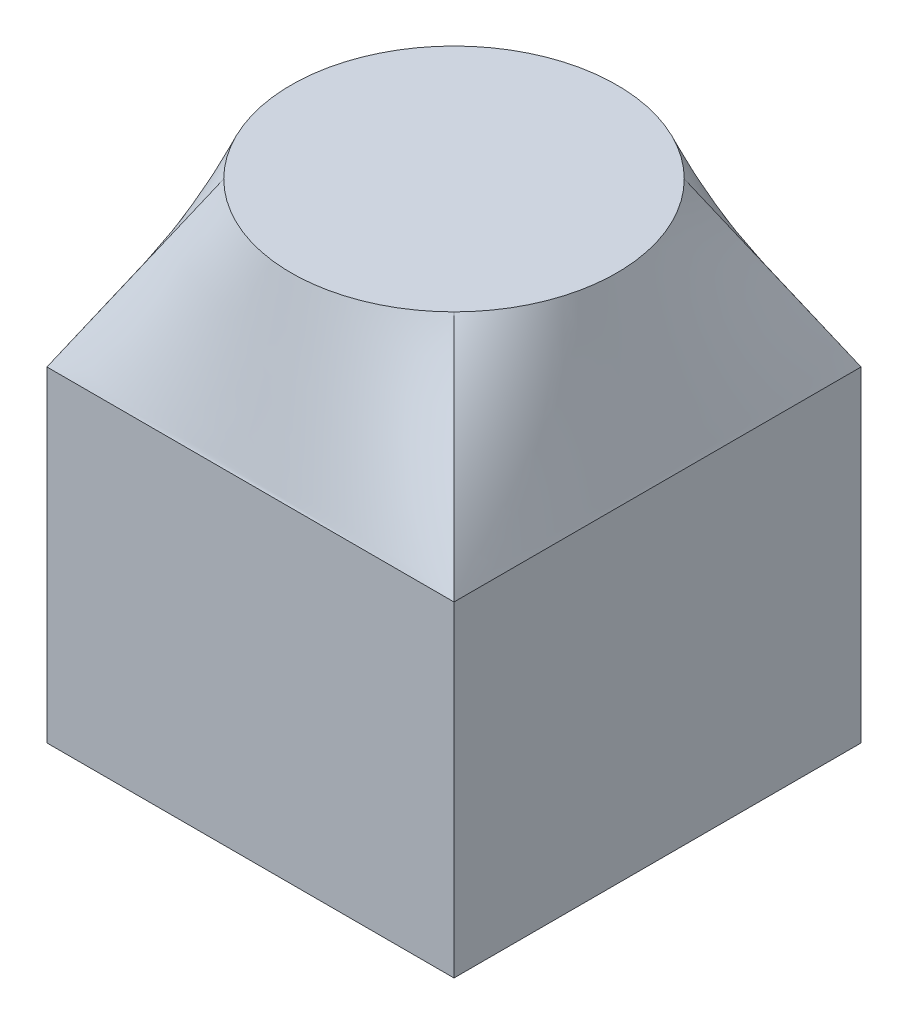
ISO-10303-21;
HEADER;
FILE_DESCRIPTION(('STEP AP214'),'2;1');
FILE_NAME('part.step','',(''),(''),'','','');
FILE_SCHEMA(('AUTOMOTIVE_DESIGN { 1 0 10303 214 1 1 1 1 }'));
ENDSEC;
DATA;
#1=APPLICATION_CONTEXT('core data for automotive mechanical design processes');
#2=APPLICATION_PROTOCOL_DEFINITION('international standard','automotive_design',2000,#1);
#3=PRODUCT_CONTEXT('',#1,'mechanical');
#4=PRODUCT('Part','Part','',(#3));
#5=PRODUCT_RELATED_PRODUCT_CATEGORY('part','',(#4));
#6=PRODUCT_DEFINITION_FORMATION('','',#4);
#7=PRODUCT_DEFINITION_CONTEXT('part definition',#1,'design');
#8=PRODUCT_DEFINITION('design','',#6,#7);
#9=PRODUCT_DEFINITION_SHAPE('','',#8);
#10=(LENGTH_UNIT() NAMED_UNIT(*) SI_UNIT(.MILLI.,.METRE.));
#11=(NAMED_UNIT(*) PLANE_ANGLE_UNIT() SI_UNIT($,.RADIAN.));
#12=(NAMED_UNIT(*) SI_UNIT($,.STERADIAN.) SOLID_ANGLE_UNIT());
#13=UNCERTAINTY_MEASURE_WITH_UNIT(LENGTH_MEASURE(1.E-05),#10,'distance_accuracy_value','');
#14=(GEOMETRIC_REPRESENTATION_CONTEXT(3) GLOBAL_UNCERTAINTY_ASSIGNED_CONTEXT((#13)) GLOBAL_UNIT_ASSIGNED_CONTEXT((#10,
#11,#12)) REPRESENTATION_CONTEXT('',''));
#15=CARTESIAN_POINT('',(0.,0.,0.));
#16=DIRECTION('',(0.,0.,1.));
#17=DIRECTION('',(1.,0.,0.));
#18=AXIS2_PLACEMENT_3D('',#15,#16,#17);
#19=CARTESIAN_POINT('',(12.5,20.,12.5));
#20=DIRECTION('',(-1.,0.,0.));
#21=DIRECTION('',(0.,0.,1.));
#22=AXIS2_PLACEMENT_3D('',#19,#20,#21);
#23=PLANE('',#22);
#24=DIRECTION('',(0.,0.,-1.));
#25=VECTOR('',#24,1.);
#26=CARTESIAN_POINT('',(12.5,0.,12.5));
#27=LINE('',#26,#25);
#28=CARTESIAN_POINT('',(12.5,0.,12.5));
#29=VERTEX_POINT('',#28);
#30=CARTESIAN_POINT('',(12.5,0.,-12.5));
#31=VERTEX_POINT('',#30);
#32=EDGE_CURVE('E234',#29,#31,#27,.T.);
#33=ORIENTED_EDGE('',*,*,#32,.T.);
#34=DIRECTION('',(0.,-1.,0.));
#35=VECTOR('',#34,1.);
#36=CARTESIAN_POINT('',(12.5,20.,-12.5));
#37=LINE('',#36,#35);
#38=CARTESIAN_POINT('',(12.5,20.,-12.5));
#39=VERTEX_POINT('',#38);
#40=EDGE_CURVE('E12',#39,#31,#37,.T.);
#41=ORIENTED_EDGE('',*,*,#40,.F.);
#42=DIRECTION('',(0.,0.,1.));
#43=VECTOR('',#42,1.);
#44=CARTESIAN_POINT('',(12.5,20.,12.5));
#45=LINE('',#44,#43);
#46=CARTESIAN_POINT('',(12.5,20.,12.5));
#47=VERTEX_POINT('',#46);
#48=EDGE_CURVE('E65',#47,#39,#45,.F.);
#49=ORIENTED_EDGE('',*,*,#48,.F.);
#50=DIRECTION('',(0.,-1.,0.));
#51=VECTOR('',#50,1.);
#52=CARTESIAN_POINT('',(12.5,20.,12.5));
#53=LINE('',#52,#51);
#54=EDGE_CURVE('E109',#47,#29,#53,.T.);
#55=ORIENTED_EDGE('',*,*,#54,.T.);
#56=EDGE_LOOP('',(#33,#41,#49,#55));
#57=FACE_BOUND('',#56,.T.);
#58=ADVANCED_FACE('F62',(#57),#23,.F.);
#59=CARTESIAN_POINT('',(-12.5,20.,-12.5));
#60=DIRECTION('',(0.,0.,1.));
#61=DIRECTION('',(1.,0.,0.));
#62=AXIS2_PLACEMENT_3D('',#59,#60,#61);
#63=PLANE('',#62);
#64=DIRECTION('',(-1.,0.,0.));
#65=VECTOR('',#64,1.);
#66=CARTESIAN_POINT('',(-12.5,0.,-12.5));
#67=LINE('',#66,#65);
#68=CARTESIAN_POINT('',(-12.5,0.,-12.5));
#69=VERTEX_POINT('',#68);
#70=EDGE_CURVE('E226',#31,#69,#67,.T.);
#71=ORIENTED_EDGE('',*,*,#70,.T.);
#72=DIRECTION('',(0.,-1.,0.));
#73=VECTOR('',#72,1.);
#74=CARTESIAN_POINT('',(-12.5,20.,-12.5));
#75=LINE('',#74,#73);
#76=CARTESIAN_POINT('',(-12.5,20.,-12.5));
#77=VERTEX_POINT('',#76);
#78=EDGE_CURVE('E71',#77,#69,#75,.T.);
#79=ORIENTED_EDGE('',*,*,#78,.F.);
#80=DIRECTION('',(1.,0.,0.));
#81=VECTOR('',#80,1.);
#82=CARTESIAN_POINT('',(-12.5,20.,-12.5));
#83=LINE('',#82,#81);
#84=EDGE_CURVE('E129',#39,#77,#83,.F.);
#85=ORIENTED_EDGE('',*,*,#84,.F.);
#86=ORIENTED_EDGE('',*,*,#40,.T.);
#87=EDGE_LOOP('',(#71,#79,#85,#86));
#88=FACE_BOUND('',#87,.T.);
#89=ADVANCED_FACE('F216',(#88),#63,.F.);
#90=CARTESIAN_POINT('',(-12.5,20.,12.5));
#91=DIRECTION('',(1.,0.,0.));
#92=DIRECTION('',(0.,0.,-1.));
#93=AXIS2_PLACEMENT_3D('',#90,#91,#92);
#94=PLANE('',#93);
#95=DIRECTION('',(0.,0.,1.));
#96=VECTOR('',#95,1.);
#97=CARTESIAN_POINT('',(-12.5,0.,12.5));
#98=LINE('',#97,#96);
#99=CARTESIAN_POINT('',(-12.5,0.,12.5));
#100=VERTEX_POINT('',#99);
#101=EDGE_CURVE('E105',#69,#100,#98,.T.);
#102=ORIENTED_EDGE('',*,*,#101,.T.);
#103=DIRECTION('',(0.,-1.,0.));
#104=VECTOR('',#103,1.);
#105=CARTESIAN_POINT('',(-12.5,20.,12.5));
#106=LINE('',#105,#104);
#107=CARTESIAN_POINT('',(-12.5,20.,12.5));
#108=VERTEX_POINT('',#107);
#109=EDGE_CURVE('E96',#108,#100,#106,.T.);
#110=ORIENTED_EDGE('',*,*,#109,.F.);
#111=DIRECTION('',(0.,0.,-1.));
#112=VECTOR('',#111,1.);
#113=CARTESIAN_POINT('',(-12.5,20.,12.5));
#114=LINE('',#113,#112);
#115=EDGE_CURVE('E101',#77,#108,#114,.F.);
#116=ORIENTED_EDGE('',*,*,#115,.F.);
#117=ORIENTED_EDGE('',*,*,#78,.T.);
#118=EDGE_LOOP('',(#102,#110,#116,#117));
#119=FACE_BOUND('',#118,.T.);
#120=ADVANCED_FACE('F98',(#119),#94,.F.);
#121=CARTESIAN_POINT('',(-12.5,20.,12.5));
#122=DIRECTION('',(0.,0.,-1.));
#123=DIRECTION('',(-1.,0.,0.));
#124=AXIS2_PLACEMENT_3D('',#121,#122,#123);
#125=PLANE('',#124);
#126=DIRECTION('',(1.,0.,0.));
#127=VECTOR('',#126,1.);
#128=CARTESIAN_POINT('',(-12.5,0.,12.5));
#129=LINE('',#128,#127);
#130=EDGE_CURVE('E237',#100,#29,#129,.T.);
#131=ORIENTED_EDGE('',*,*,#130,.T.);
#132=ORIENTED_EDGE('',*,*,#54,.F.);
#133=DIRECTION('',(-1.,0.,0.));
#134=VECTOR('',#133,1.);
#135=CARTESIAN_POINT('',(-12.5,20.,12.5));
#136=LINE('',#135,#134);
#137=EDGE_CURVE('E112',#108,#47,#136,.F.);
#138=ORIENTED_EDGE('',*,*,#137,.F.);
#139=ORIENTED_EDGE('',*,*,#109,.T.);
#140=EDGE_LOOP('',(#131,#132,#138,#139));
#141=FACE_BOUND('',#140,.T.);
#142=ADVANCED_FACE('F113',(#141),#125,.F.);
#143=CARTESIAN_POINT('',(0.,0.,0.));
#144=DIRECTION('',(0.,-1.,0.));
#145=DIRECTION('',(0.,0.,-1.));
#146=AXIS2_PLACEMENT_3D('',#143,#144,#145);
#147=PLANE('',#146);
#148=DIRECTION('',(0.,0.,1.));
#149=VECTOR('',#148,1.);
#150=CARTESIAN_POINT('',(9.4,0.,-9.4));
#151=LINE('',#150,#149);
#152=CARTESIAN_POINT('',(9.4,0.,-9.4));
#153=VERTEX_POINT('',#152);
#154=CARTESIAN_POINT('',(9.4,0.,9.4));
#155=VERTEX_POINT('',#154);
#156=EDGE_CURVE('E80',#153,#155,#151,.T.);
#157=ORIENTED_EDGE('',*,*,#156,.F.);
#158=DIRECTION('',(1.,0.,0.));
#159=VECTOR('',#158,1.);
#160=CARTESIAN_POINT('',(-9.4,0.,-9.4));
#161=LINE('',#160,#159);
#162=CARTESIAN_POINT('',(-9.4,0.,-9.4));
#163=VERTEX_POINT('',#162);
#164=EDGE_CURVE('E262',#163,#153,#161,.T.);
#165=ORIENTED_EDGE('',*,*,#164,.F.);
#166=DIRECTION('',(0.,0.,-1.));
#167=VECTOR('',#166,1.);
#168=CARTESIAN_POINT('',(-9.4,0.,-9.4));
#169=LINE('',#168,#167);
#170=CARTESIAN_POINT('',(-9.4,0.,9.4));
#171=VERTEX_POINT('',#170);
#172=EDGE_CURVE('E266',#171,#163,#169,.T.);
#173=ORIENTED_EDGE('',*,*,#172,.F.);
#174=DIRECTION('',(-1.,0.,0.));
#175=VECTOR('',#174,1.);
#176=CARTESIAN_POINT('',(-9.4,0.,9.4));
#177=LINE('',#176,#175);
#178=EDGE_CURVE('E269',#155,#171,#177,.T.);
#179=ORIENTED_EDGE('',*,*,#178,.F.);
#180=EDGE_LOOP('',(#157,#165,#173,#179));
#181=FACE_BOUND('',#180,.T.);
#182=ORIENTED_EDGE('',*,*,#32,.F.);
#183=ORIENTED_EDGE('',*,*,#130,.F.);
#184=ORIENTED_EDGE('',*,*,#101,.F.);
#185=ORIENTED_EDGE('',*,*,#70,.F.);
#186=EDGE_LOOP('',(#182,#183,#184,#185));
#187=FACE_BOUND('',#186,.T.);
#188=ADVANCED_FACE('F209',(#181,#187),#147,.T.);
#189=CARTESIAN_POINT('',(9.4,18.8,-9.4));
#190=DIRECTION('',(1.,0.,0.));
#191=DIRECTION('',(0.,0.,-1.));
#192=AXIS2_PLACEMENT_3D('',#189,#190,#191);
#193=PLANE('',#192);
#194=ORIENTED_EDGE('',*,*,#156,.T.);
#195=DIRECTION('',(0.,-1.,0.));
#196=VECTOR('',#195,1.);
#197=CARTESIAN_POINT('',(9.4,18.8,9.4));
#198=LINE('',#197,#196);
#199=CARTESIAN_POINT('',(9.4,18.8,9.4));
#200=VERTEX_POINT('',#199);
#201=EDGE_CURVE('E254',#200,#155,#198,.T.);
#202=ORIENTED_EDGE('',*,*,#201,.F.);
#203=DIRECTION('',(0.,0.,1.));
#204=VECTOR('',#203,1.);
#205=CARTESIAN_POINT('',(9.4,18.8,-9.4));
#206=LINE('',#205,#204);
#207=CARTESIAN_POINT('',(9.4,18.8,-9.4));
#208=VERTEX_POINT('',#207);
#209=EDGE_CURVE('E265',#208,#200,#206,.T.);
#210=ORIENTED_EDGE('',*,*,#209,.F.);
#211=DIRECTION('',(0.,-1.,0.));
#212=VECTOR('',#211,1.);
#213=CARTESIAN_POINT('',(9.4,18.8,-9.4));
#214=LINE('',#213,#212);
#215=EDGE_CURVE('E250',#208,#153,#214,.T.);
#216=ORIENTED_EDGE('',*,*,#215,.T.);
#217=EDGE_LOOP('',(#194,#202,#210,#216));
#218=FACE_BOUND('',#217,.T.);
#219=ADVANCED_FACE('F199',(#218),#193,.F.);
#220=CARTESIAN_POINT('',(-9.4,18.8,-9.4));
#221=DIRECTION('',(0.,0.,-1.));
#222=DIRECTION('',(-1.,0.,0.));
#223=AXIS2_PLACEMENT_3D('',#220,#221,#222);
#224=PLANE('',#223);
#225=ORIENTED_EDGE('',*,*,#164,.T.);
#226=ORIENTED_EDGE('',*,*,#215,.F.);
#227=DIRECTION('',(1.,0.,0.));
#228=VECTOR('',#227,1.);
#229=CARTESIAN_POINT('',(-9.4,18.8,-9.4));
#230=LINE('',#229,#228);
#231=CARTESIAN_POINT('',(-9.4,18.8,-9.4));
#232=VERTEX_POINT('',#231);
#233=EDGE_CURVE('E257',#232,#208,#230,.T.);
#234=ORIENTED_EDGE('',*,*,#233,.F.);
#235=DIRECTION('',(0.,-1.,0.));
#236=VECTOR('',#235,1.);
#237=CARTESIAN_POINT('',(-9.4,18.8,-9.4));
#238=LINE('',#237,#236);
#239=EDGE_CURVE('E251',#232,#163,#238,.T.);
#240=ORIENTED_EDGE('',*,*,#239,.T.);
#241=EDGE_LOOP('',(#225,#226,#234,#240));
#242=FACE_BOUND('',#241,.T.);
#243=ADVANCED_FACE('F195',(#242),#224,.F.);
#244=CARTESIAN_POINT('',(-9.4,18.8,-9.4));
#245=DIRECTION('',(-1.,0.,0.));
#246=DIRECTION('',(0.,0.,1.));
#247=AXIS2_PLACEMENT_3D('',#244,#245,#246);
#248=PLANE('',#247);
#249=ORIENTED_EDGE('',*,*,#172,.T.);
#250=ORIENTED_EDGE('',*,*,#239,.F.);
#251=DIRECTION('',(0.,0.,-1.));
#252=VECTOR('',#251,1.);
#253=CARTESIAN_POINT('',(-9.4,18.8,-9.4));
#254=LINE('',#253,#252);
#255=CARTESIAN_POINT('',(-9.4,18.8,9.4));
#256=VERTEX_POINT('',#255);
#257=EDGE_CURVE('E275',#256,#232,#254,.T.);
#258=ORIENTED_EDGE('',*,*,#257,.F.);
#259=DIRECTION('',(0.,-1.,0.));
#260=VECTOR('',#259,1.);
#261=CARTESIAN_POINT('',(-9.4,18.8,9.4));
#262=LINE('',#261,#260);
#263=EDGE_CURVE('E256',#256,#171,#262,.T.);
#264=ORIENTED_EDGE('',*,*,#263,.T.);
#265=EDGE_LOOP('',(#249,#250,#258,#264));
#266=FACE_BOUND('',#265,.T.);
#267=ADVANCED_FACE('F198',(#266),#248,.F.);
#268=CARTESIAN_POINT('',(-9.4,18.8,9.4));
#269=DIRECTION('',(0.,0.,1.));
#270=DIRECTION('',(1.,0.,0.));
#271=AXIS2_PLACEMENT_3D('',#268,#269,#270);
#272=PLANE('',#271);
#273=ORIENTED_EDGE('',*,*,#178,.T.);
#274=ORIENTED_EDGE('',*,*,#263,.F.);
#275=DIRECTION('',(-1.,0.,0.));
#276=VECTOR('',#275,1.);
#277=CARTESIAN_POINT('',(-9.4,18.8,9.4));
#278=LINE('',#277,#276);
#279=EDGE_CURVE('E278',#200,#256,#278,.T.);
#280=ORIENTED_EDGE('',*,*,#279,.F.);
#281=ORIENTED_EDGE('',*,*,#201,.T.);
#282=EDGE_LOOP('',(#273,#274,#280,#281));
#283=FACE_BOUND('',#282,.T.);
#284=ADVANCED_FACE('F193',(#283),#272,.F.);
#285=CARTESIAN_POINT('',(0.,18.8,0.));
#286=DIRECTION('',(0.,1.,0.));
#287=DIRECTION('',(0.,0.,1.));
#288=AXIS2_PLACEMENT_3D('',#285,#286,#287);
#289=PLANE('',#288);
#290=ORIENTED_EDGE('',*,*,#209,.T.);
#291=ORIENTED_EDGE('',*,*,#279,.T.);
#292=ORIENTED_EDGE('',*,*,#257,.T.);
#293=ORIENTED_EDGE('',*,*,#233,.T.);
#294=EDGE_LOOP('',(#290,#291,#292,#293));
#295=FACE_BOUND('',#294,.T.);
#296=ADVANCED_FACE('F184',(#295),#289,.F.);
#297=CARTESIAN_POINT('',(0.,30.,0.));
#298=DIRECTION('',(0.,1.,0.));
#299=DIRECTION('',(0.,0.,1.));
#300=AXIS2_PLACEMENT_3D('',#297,#298,#299);
#301=PLANE('',#300);
#302=CARTESIAN_POINT('',(0.,30.,0.));
#303=DIRECTION('',(0.,1.,0.));
#304=DIRECTION('',(0.,0.,1.));
#305=AXIS2_PLACEMENT_3D('',#302,#303,#304);
#306=CIRCLE('',#305,10.);
#307=CARTESIAN_POINT('',(-7.07106781186548,30.,-7.07106781186548));
#308=VERTEX_POINT('',#307);
#309=CARTESIAN_POINT('',(-7.07106781186548,30.,7.07106781186547));
#310=VERTEX_POINT('',#309);
#311=EDGE_CURVE('E137',#308,#310,#306,.T.);
#312=ORIENTED_EDGE('',*,*,#311,.T.);
#313=CARTESIAN_POINT('',(7.07106781186548,30.,7.07106781186548));
#314=VERTEX_POINT('',#313);
#315=EDGE_CURVE('E134',#310,#314,#306,.T.);
#316=ORIENTED_EDGE('',*,*,#315,.T.);
#317=CARTESIAN_POINT('',(7.07106781186548,30.,-7.07106781186548));
#318=VERTEX_POINT('',#317);
#319=EDGE_CURVE('E317',#314,#318,#306,.T.);
#320=ORIENTED_EDGE('',*,*,#319,.T.);
#321=EDGE_CURVE('E163',#318,#308,#306,.T.);
#322=ORIENTED_EDGE('',*,*,#321,.T.);
#323=EDGE_LOOP('',(#312,#316,#320,#322));
#324=FACE_BOUND('',#323,.T.);
#325=ADVANCED_FACE('F192',(#324),#301,.T.);
#326=CARTESIAN_POINT('',(-12.5,20.,12.5));
#327=CARTESIAN_POINT('',(-7.07106781186548,30.,7.07106781186547));
#328=CARTESIAN_POINT('',(-11.4583333333333,20.,12.5));
#329=CARTESIAN_POINT('',(-6.65440114519881,30.,7.48773447853214));
#330=CARTESIAN_POINT('',(-10.4166666666667,20.,12.5));
#331=CARTESIAN_POINT('',(-6.18511190982561,30.,7.88294229636119));
#332=CARTESIAN_POINT('',(-8.33333333333333,20.,12.5));
#333=CARTESIAN_POINT('',(-5.14757980414371,30.,8.59644174904935));
#334=CARTESIAN_POINT('',(-7.29166666666666,20.,12.5));
#335=CARTESIAN_POINT('',(-4.57928394964498,30.,8.91450237104857));
#336=CARTESIAN_POINT('',(-5.20833333333333,20.,12.5));
#337=CARTESIAN_POINT('',(-3.36426300033644,30.,9.44033518893656));
#338=CARTESIAN_POINT('',(-4.16666666666666,20.,12.5));
#339=CARTESIAN_POINT('',(-2.71763303055414,30.,9.64784964914938));
#340=CARTESIAN_POINT('',(-2.08333333333333,20.,12.5));
#341=CARTESIAN_POINT('',(-1.380556458553,30.,9.92776893395985));
#342=CARTESIAN_POINT('',(-1.04166666666666,20.,12.5));
#343=CARTESIAN_POINT('',(-0.690355937288493,30.,10.));
#344=CARTESIAN_POINT('',(1.04166666666667,20.,12.5));
#345=CARTESIAN_POINT('',(0.690355937288491,30.,10.));
#346=CARTESIAN_POINT('',(2.08333333333333,20.,12.5));
#347=CARTESIAN_POINT('',(1.380556458553,30.,9.92776893395986));
#348=CARTESIAN_POINT('',(4.16666666666667,20.,12.5));
#349=CARTESIAN_POINT('',(2.71763303055414,30.,9.64784964914939));
#350=CARTESIAN_POINT('',(5.20833333333333,20.,12.5));
#351=CARTESIAN_POINT('',(3.36426300033644,30.,9.44033518893657));
#352=CARTESIAN_POINT('',(7.29166666666667,20.,12.5));
#353=CARTESIAN_POINT('',(4.57928394964498,30.,8.91450237104858));
#354=CARTESIAN_POINT('',(8.33333333333334,20.,12.5));
#355=CARTESIAN_POINT('',(5.14757980414371,30.,8.59644174904935));
#356=CARTESIAN_POINT('',(10.4166666666667,20.,12.5));
#357=CARTESIAN_POINT('',(6.18511190982561,30.,7.88294229636119));
#358=CARTESIAN_POINT('',(11.4583333333333,20.,12.5));
#359=CARTESIAN_POINT('',(6.65440114519881,30.,7.48773447853214));
#360=CARTESIAN_POINT('',(12.5,20.,12.5));
#361=CARTESIAN_POINT('',(7.07106781186548,30.,7.07106781186548));
#362=B_SPLINE_SURFACE_WITH_KNOTS('',3,1,((#326,#327),(#328,#329),(#330,#331),(#332,#333),(#334,
#335),(#336,#337),(#338,#339),(#340,#341),(#342,#343),(#344,#345),(#346,#347),(#348,#349),(#350,
#351),(#352,#353),(#354,#355),(#356,#357),(#358,#359),(#360,#361)),.UNSPECIFIED.,.F.,.F.,.F.,(4,
2,2,2,2,2,2,2,4),(2,2),(0.,0.125,0.25,0.375,0.5,0.625,0.75,0.875,1.),(0.,1.),.UNSPECIFIED.);
#363=DIRECTION('',(-0.430614632146906,0.793184768614457,-0.430614632146906));
#364=VECTOR('',#363,1.);
#365=CARTESIAN_POINT('',(9.78553390593274,25.,9.78553390593274));
#366=LINE('',#365,#364);
#367=EDGE_CURVE('E136',#47,#314,#366,.T.);
#368=DIRECTION('',(-0.430614632146906,-0.793184768614457,0.430614632146906));
#369=VECTOR('',#368,1.);
#370=CARTESIAN_POINT('',(-9.78553390593274,25.,9.78553390593274));
#371=LINE('',#370,#369);
#372=EDGE_CURVE('E126',#310,#108,#371,.T.);
#373=ORIENTED_EDGE('',*,*,#137,.T.);
#374=ORIENTED_EDGE('',*,*,#367,.T.);
#375=ORIENTED_EDGE('',*,*,#315,.F.);
#376=ORIENTED_EDGE('',*,*,#372,.T.);
#377=EDGE_LOOP('',(#373,#374,#375,#376));
#378=FACE_BOUND('',#377,.T.);
#379=ADVANCED_FACE('F132',(#378),#362,.T.);
#380=CARTESIAN_POINT('',(12.5,20.,12.5));
#381=CARTESIAN_POINT('',(7.07106781186548,30.,7.07106781186548));
#382=CARTESIAN_POINT('',(12.5,20.,11.4583333333333));
#383=CARTESIAN_POINT('',(7.48773447853214,30.,6.65440114519881));
#384=CARTESIAN_POINT('',(12.5,20.,10.4166666666667));
#385=CARTESIAN_POINT('',(7.88294229636119,30.,6.18511190982561));
#386=CARTESIAN_POINT('',(12.5,20.,8.33333333333333));
#387=CARTESIAN_POINT('',(8.59644174904935,30.,5.1475798041437));
#388=CARTESIAN_POINT('',(12.5,20.,7.29166666666666));
#389=CARTESIAN_POINT('',(8.91450237104858,30.,4.57928394964498));
#390=CARTESIAN_POINT('',(12.5,20.,5.20833333333333));
#391=CARTESIAN_POINT('',(9.44033518893657,30.,3.36426300033644));
#392=CARTESIAN_POINT('',(12.5,20.,4.16666666666666));
#393=CARTESIAN_POINT('',(9.64784964914938,30.,2.71763303055414));
#394=CARTESIAN_POINT('',(12.5,20.,2.08333333333332));
#395=CARTESIAN_POINT('',(9.92776893395986,30.,1.380556458553));
#396=CARTESIAN_POINT('',(12.5,20.,1.04166666666666));
#397=CARTESIAN_POINT('',(10.,30.,0.690355937288493));
#398=CARTESIAN_POINT('',(12.5,20.,-1.04166666666668));
#399=CARTESIAN_POINT('',(10.,30.,-0.69035593728849));
#400=CARTESIAN_POINT('',(12.5,20.,-2.08333333333334));
#401=CARTESIAN_POINT('',(9.92776893395985,30.,-1.380556458553));
#402=CARTESIAN_POINT('',(12.5,20.,-4.16666666666668));
#403=CARTESIAN_POINT('',(9.64784964914939,30.,-2.71763303055414));
#404=CARTESIAN_POINT('',(12.5,20.,-5.20833333333334));
#405=CARTESIAN_POINT('',(9.44033518893657,30.,-3.36426300033644));
#406=CARTESIAN_POINT('',(12.5,20.,-7.29166666666668));
#407=CARTESIAN_POINT('',(8.91450237104857,30.,-4.57928394964498));
#408=CARTESIAN_POINT('',(12.5,20.,-8.33333333333334));
#409=CARTESIAN_POINT('',(8.59644174904935,30.,-5.1475798041437));
#410=CARTESIAN_POINT('',(12.5,20.,-10.4166666666667));
#411=CARTESIAN_POINT('',(7.88294229636119,30.,-6.1851119098256));
#412=CARTESIAN_POINT('',(12.5,20.,-11.4583333333333));
#413=CARTESIAN_POINT('',(7.48773447853214,30.,-6.65440114519881));
#414=CARTESIAN_POINT('',(12.5,20.,-12.5));
#415=CARTESIAN_POINT('',(7.07106781186548,30.,-7.07106781186548));
#416=B_SPLINE_SURFACE_WITH_KNOTS('',3,1,((#380,#381),(#382,#383),(#384,#385),(#386,#387),(#388,
#389),(#390,#391),(#392,#393),(#394,#395),(#396,#397),(#398,#399),(#400,#401),(#402,#403),(#404,
#405),(#406,#407),(#408,#409),(#410,#411),(#412,#413),(#414,#415)),.UNSPECIFIED.,.F.,.F.,.F.,(4,
2,2,2,2,2,2,2,4),(2,2),(0.,0.125,0.25,0.375,0.5,0.625,0.75,0.875,1.),(0.,1.),.UNSPECIFIED.);
#417=DIRECTION('',(-0.430614632146906,0.793184768614457,0.430614632146906));
#418=VECTOR('',#417,1.);
#419=CARTESIAN_POINT('',(9.78553390593274,25.,-9.78553390593274));
#420=LINE('',#419,#418);
#421=EDGE_CURVE('E139',#39,#318,#420,.T.);
#422=ORIENTED_EDGE('',*,*,#48,.T.);
#423=ORIENTED_EDGE('',*,*,#421,.T.);
#424=ORIENTED_EDGE('',*,*,#319,.F.);
#425=ORIENTED_EDGE('',*,*,#367,.F.);
#426=EDGE_LOOP('',(#422,#423,#424,#425));
#427=FACE_BOUND('',#426,.T.);
#428=ADVANCED_FACE('F245',(#427),#416,.T.);
#429=CARTESIAN_POINT('',(-12.5,20.,-12.5));
#430=CARTESIAN_POINT('',(-7.07106781186547,30.,-7.07106781186548));
#431=CARTESIAN_POINT('',(-12.5,20.,-11.4583333333333));
#432=CARTESIAN_POINT('',(-7.48773447853214,30.,-6.65440114519881));
#433=CARTESIAN_POINT('',(-12.5,20.,-10.4166666666667));
#434=CARTESIAN_POINT('',(-7.88294229636119,30.,-6.18511190982561));
#435=CARTESIAN_POINT('',(-12.5,20.,-8.33333333333333));
#436=CARTESIAN_POINT('',(-8.59644174904935,30.,-5.1475798041437));
#437=CARTESIAN_POINT('',(-12.5,20.,-7.29166666666666));
#438=CARTESIAN_POINT('',(-8.91450237104857,30.,-4.57928394964498));
#439=CARTESIAN_POINT('',(-12.5,20.,-5.20833333333332));
#440=CARTESIAN_POINT('',(-9.44033518893656,30.,-3.36426300033644));
#441=CARTESIAN_POINT('',(-12.5,20.,-4.16666666666666));
#442=CARTESIAN_POINT('',(-9.64784964914938,30.,-2.71763303055414));
#443=CARTESIAN_POINT('',(-12.5,20.,-2.08333333333332));
#444=CARTESIAN_POINT('',(-9.92776893395986,30.,-1.380556458553));
#445=CARTESIAN_POINT('',(-12.5,20.,-1.04166666666666));
#446=CARTESIAN_POINT('',(-10.,30.,-0.690355937288494));
#447=CARTESIAN_POINT('',(-12.5,20.,1.04166666666667));
#448=CARTESIAN_POINT('',(-10.,30.,0.69035593728849));
#449=CARTESIAN_POINT('',(-12.5,20.,2.08333333333334));
#450=CARTESIAN_POINT('',(-9.92776893395986,30.,1.38055645855299));
#451=CARTESIAN_POINT('',(-12.5,20.,4.16666666666667));
#452=CARTESIAN_POINT('',(-9.64784964914939,30.,2.71763303055414));
#453=CARTESIAN_POINT('',(-12.5,20.,5.20833333333334));
#454=CARTESIAN_POINT('',(-9.44033518893657,30.,3.36426300033644));
#455=CARTESIAN_POINT('',(-12.5,20.,7.29166666666667));
#456=CARTESIAN_POINT('',(-8.91450237104857,30.,4.57928394964497));
#457=CARTESIAN_POINT('',(-12.5,20.,8.33333333333334));
#458=CARTESIAN_POINT('',(-8.59644174904935,30.,5.1475798041437));
#459=CARTESIAN_POINT('',(-12.5,20.,10.4166666666667));
#460=CARTESIAN_POINT('',(-7.88294229636119,30.,6.1851119098256));
#461=CARTESIAN_POINT('',(-12.5,20.,11.4583333333333));
#462=CARTESIAN_POINT('',(-7.48773447853215,30.,6.65440114519881));
#463=CARTESIAN_POINT('',(-12.5,20.,12.5));
#464=CARTESIAN_POINT('',(-7.07106781186547,30.,7.07106781186548));
#465=B_SPLINE_SURFACE_WITH_KNOTS('',3,1,((#429,#430),(#431,#432),(#433,#434),(#435,#436),(#437,
#438),(#439,#440),(#441,#442),(#443,#444),(#445,#446),(#447,#448),(#449,#450),(#451,#452),(#453,
#454),(#455,#456),(#457,#458),(#459,#460),(#461,#462),(#463,#464)),.UNSPECIFIED.,.F.,.F.,.F.,(4,
2,2,2,2,2,2,2,4),(2,2),(0.,0.125,0.25,0.375,0.5,0.625,0.75,0.875,1.),(0.,1.),.UNSPECIFIED.);
#466=DIRECTION('',(0.430614632146906,0.793184768614457,0.430614632146906));
#467=VECTOR('',#466,1.);
#468=CARTESIAN_POINT('',(-9.78553390593274,25.,-9.78553390593274));
#469=LINE('',#468,#467);
#470=EDGE_CURVE('E128',#77,#308,#469,.T.);
#471=ORIENTED_EDGE('',*,*,#115,.T.);
#472=ORIENTED_EDGE('',*,*,#372,.F.);
#473=ORIENTED_EDGE('',*,*,#311,.F.);
#474=ORIENTED_EDGE('',*,*,#470,.F.);
#475=EDGE_LOOP('',(#471,#472,#473,#474));
#476=FACE_BOUND('',#475,.T.);
#477=ADVANCED_FACE('F123',(#476),#465,.T.);
#478=CARTESIAN_POINT('',(12.5,20.,-12.5));
#479=CARTESIAN_POINT('',(7.07106781186548,30.,-7.07106781186547));
#480=CARTESIAN_POINT('',(11.4583333333333,20.,-12.5));
#481=CARTESIAN_POINT('',(6.65440114519881,30.,-7.48773447853214));
#482=CARTESIAN_POINT('',(10.4166666666667,20.,-12.5));
#483=CARTESIAN_POINT('',(6.18511190982561,30.,-7.88294229636119));
#484=CARTESIAN_POINT('',(8.33333333333333,20.,-12.5));
#485=CARTESIAN_POINT('',(5.1475798041437,30.,-8.59644174904935));
#486=CARTESIAN_POINT('',(7.29166666666667,20.,-12.5));
#487=CARTESIAN_POINT('',(4.57928394964498,30.,-8.91450237104857));
#488=CARTESIAN_POINT('',(5.20833333333333,20.,-12.5));
#489=CARTESIAN_POINT('',(3.36426300033644,30.,-9.44033518893656));
#490=CARTESIAN_POINT('',(4.16666666666667,20.,-12.5));
#491=CARTESIAN_POINT('',(2.71763303055414,30.,-9.64784964914939));
#492=CARTESIAN_POINT('',(2.08333333333333,20.,-12.5));
#493=CARTESIAN_POINT('',(1.380556458553,30.,-9.92776893395986));
#494=CARTESIAN_POINT('',(1.04166666666666,20.,-12.5));
#495=CARTESIAN_POINT('',(0.690355937288493,30.,-10.));
#496=CARTESIAN_POINT('',(-1.04166666666667,20.,-12.5));
#497=CARTESIAN_POINT('',(-0.69035593728849,30.,-10.));
#498=CARTESIAN_POINT('',(-2.08333333333334,20.,-12.5));
#499=CARTESIAN_POINT('',(-1.380556458553,30.,-9.92776893395986));
#500=CARTESIAN_POINT('',(-4.16666666666667,20.,-12.5));
#501=CARTESIAN_POINT('',(-2.71763303055414,30.,-9.64784964914939));
#502=CARTESIAN_POINT('',(-5.20833333333334,20.,-12.5));
#503=CARTESIAN_POINT('',(-3.36426300033644,30.,-9.44033518893657));
#504=CARTESIAN_POINT('',(-7.29166666666667,20.,-12.5));
#505=CARTESIAN_POINT('',(-4.57928394964498,30.,-8.91450237104857));
#506=CARTESIAN_POINT('',(-8.33333333333334,20.,-12.5));
#507=CARTESIAN_POINT('',(-5.1475798041437,30.,-8.59644174904935));
#508=CARTESIAN_POINT('',(-10.4166666666667,20.,-12.5));
#509=CARTESIAN_POINT('',(-6.1851119098256,30.,-7.88294229636119));
#510=CARTESIAN_POINT('',(-11.4583333333333,20.,-12.5));
#511=CARTESIAN_POINT('',(-6.65440114519881,30.,-7.48773447853215));
#512=CARTESIAN_POINT('',(-12.5,20.,-12.5));
#513=CARTESIAN_POINT('',(-7.07106781186548,30.,-7.07106781186548));
#514=B_SPLINE_SURFACE_WITH_KNOTS('',3,1,((#478,#479),(#480,#481),(#482,#483),(#484,#485),(#486,
#487),(#488,#489),(#490,#491),(#492,#493),(#494,#495),(#496,#497),(#498,#499),(#500,#501),(#502,
#503),(#504,#505),(#506,#507),(#508,#509),(#510,#511),(#512,#513)),.UNSPECIFIED.,.F.,.F.,.F.,(4,
2,2,2,2,2,2,2,4),(2,2),(0.,0.125,0.25,0.375,0.5,0.625,0.75,0.875,1.),(0.,1.),.UNSPECIFIED.);
#515=ORIENTED_EDGE('',*,*,#84,.T.);
#516=ORIENTED_EDGE('',*,*,#470,.T.);
#517=ORIENTED_EDGE('',*,*,#321,.F.);
#518=ORIENTED_EDGE('',*,*,#421,.F.);
#519=EDGE_LOOP('',(#515,#516,#517,#518));
#520=FACE_BOUND('',#519,.T.);
#521=ADVANCED_FACE('F168',(#520),#514,.T.);
#522=CLOSED_SHELL('',(#58,#89,#120,#142,#188,#219,#243,#267,#284,#296,#325,#379,#428,#477,#521));
#523=MANIFOLD_SOLID_BREP('B2',#522);
#524=ADVANCED_BREP_SHAPE_REPRESENTATION('',(#18,#523),#14);
#525=SHAPE_DEFINITION_REPRESENTATION(#9,#524);
ENDSEC;
END-ISO-10303-21;
